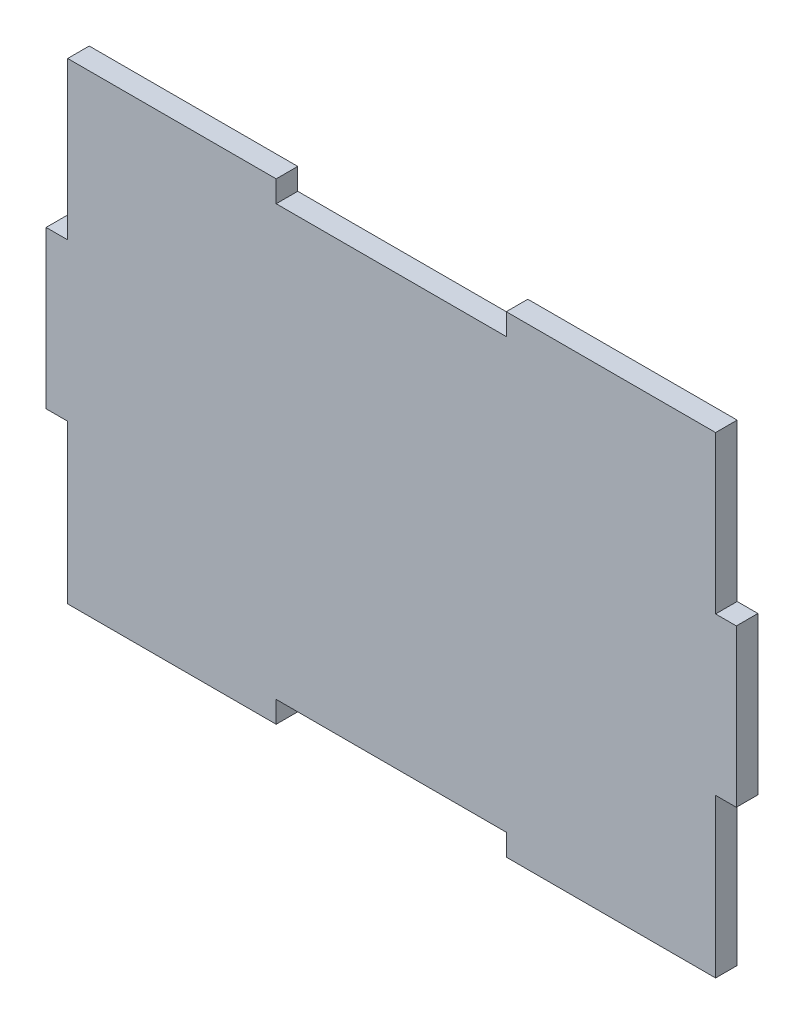
ISO-10303-21;
HEADER;
FILE_DESCRIPTION(('STEP AP214'),'2;1');
FILE_NAME('part.step','',(''),(''),'','','');
FILE_SCHEMA(('AUTOMOTIVE_DESIGN { 1 0 10303 214 1 1 1 1 }'));
ENDSEC;
DATA;
#1=APPLICATION_CONTEXT('core data for automotive mechanical design processes');
#2=APPLICATION_PROTOCOL_DEFINITION('international standard','automotive_design',2000,#1);
#3=PRODUCT_CONTEXT('',#1,'mechanical');
#4=PRODUCT('Part','Part','',(#3));
#5=PRODUCT_RELATED_PRODUCT_CATEGORY('part','',(#4));
#6=PRODUCT_DEFINITION_FORMATION('','',#4);
#7=PRODUCT_DEFINITION_CONTEXT('part definition',#1,'design');
#8=PRODUCT_DEFINITION('design','',#6,#7);
#9=PRODUCT_DEFINITION_SHAPE('','',#8);
#10=(LENGTH_UNIT() NAMED_UNIT(*) SI_UNIT(.MILLI.,.METRE.));
#11=(NAMED_UNIT(*) PLANE_ANGLE_UNIT() SI_UNIT($,.RADIAN.));
#12=(NAMED_UNIT(*) SI_UNIT($,.STERADIAN.) SOLID_ANGLE_UNIT());
#13=UNCERTAINTY_MEASURE_WITH_UNIT(LENGTH_MEASURE(1.E-05),#10,'distance_accuracy_value','');
#14=(GEOMETRIC_REPRESENTATION_CONTEXT(3) GLOBAL_UNCERTAINTY_ASSIGNED_CONTEXT((#13)) GLOBAL_UNIT_ASSIGNED_CONTEXT((#10,
#11,#12)) REPRESENTATION_CONTEXT('',''));
#15=CARTESIAN_POINT('',(0.,0.,0.));
#16=DIRECTION('',(0.,0.,1.));
#17=DIRECTION('',(1.,0.,0.));
#18=AXIS2_PLACEMENT_3D('',#15,#16,#17);
#19=CARTESIAN_POINT('',(40.64,27.813,2.54));
#20=DIRECTION('',(0.,-1.,0.));
#21=DIRECTION('',(1.,0.,0.));
#22=AXIS2_PLACEMENT_3D('',#19,#20,#21);
#23=PLANE('',#22);
#24=DIRECTION('',(0.,0.,1.));
#25=VECTOR('',#24,1.);
#26=CARTESIAN_POINT('',(13.5466666666679,27.813,50.8));
#27=LINE('',#26,#25);
#28=CARTESIAN_POINT('',(13.546666666668,27.813,0.));
#29=VERTEX_POINT('',#28);
#30=CARTESIAN_POINT('',(13.5466666666679,27.813,2.54));
#31=VERTEX_POINT('',#30);
#32=EDGE_CURVE('E182',#29,#31,#27,.T.);
#33=ORIENTED_EDGE('',*,*,#32,.T.);
#34=DIRECTION('',(-1.,0.,0.));
#35=VECTOR('',#34,1.);
#36=CARTESIAN_POINT('',(40.64,27.813,2.54));
#37=LINE('',#36,#35);
#38=CARTESIAN_POINT('',(38.1995707833595,27.813,2.54));
#39=VERTEX_POINT('',#38);
#40=EDGE_CURVE('E43',#39,#31,#37,.T.);
#41=ORIENTED_EDGE('',*,*,#40,.F.);
#42=DIRECTION('',(0.,0.,1.));
#43=VECTOR('',#42,1.);
#44=CARTESIAN_POINT('',(38.1995707833595,27.813,0.));
#45=LINE('',#44,#43);
#46=CARTESIAN_POINT('',(38.1995707833595,27.813,0.));
#47=VERTEX_POINT('',#46);
#48=EDGE_CURVE('E254',#47,#39,#45,.T.);
#49=ORIENTED_EDGE('',*,*,#48,.F.);
#50=DIRECTION('',(-1.,0.,0.));
#51=VECTOR('',#50,1.);
#52=CARTESIAN_POINT('',(40.64,27.813,0.));
#53=LINE('',#52,#51);
#54=EDGE_CURVE('E300',#47,#29,#53,.T.);
#55=ORIENTED_EDGE('',*,*,#54,.T.);
#56=EDGE_LOOP('',(#33,#41,#49,#55));
#57=FACE_BOUND('',#56,.T.);
#58=ADVANCED_FACE('F35',(#57),#23,.F.);
#59=CARTESIAN_POINT('',(40.64,-27.813,2.54));
#60=DIRECTION('',(0.,1.,0.));
#61=DIRECTION('',(-1.,0.,0.));
#62=AXIS2_PLACEMENT_3D('',#59,#60,#61);
#63=PLANE('',#62);
#64=DIRECTION('',(0.,0.,1.));
#65=VECTOR('',#64,1.);
#66=CARTESIAN_POINT('',(-13.5466666666654,-27.813,50.8));
#67=LINE('',#66,#65);
#68=CARTESIAN_POINT('',(-13.5466666666654,-27.813,0.));
#69=VERTEX_POINT('',#68);
#70=CARTESIAN_POINT('',(-13.5466666666654,-27.813,2.54));
#71=VERTEX_POINT('',#70);
#72=EDGE_CURVE('E203',#69,#71,#67,.T.);
#73=ORIENTED_EDGE('',*,*,#72,.T.);
#74=DIRECTION('',(1.,0.,0.));
#75=VECTOR('',#74,1.);
#76=CARTESIAN_POINT('',(40.64,-27.813,2.54));
#77=LINE('',#76,#75);
#78=CARTESIAN_POINT('',(-38.1,-27.813,2.54));
#79=VERTEX_POINT('',#78);
#80=EDGE_CURVE('E301',#79,#71,#77,.T.);
#81=ORIENTED_EDGE('',*,*,#80,.F.);
#82=DIRECTION('',(0.,0.,1.));
#83=VECTOR('',#82,1.);
#84=CARTESIAN_POINT('',(-38.1,-27.813,0.));
#85=LINE('',#84,#83);
#86=CARTESIAN_POINT('',(-38.1,-27.813,0.));
#87=VERTEX_POINT('',#86);
#88=EDGE_CURVE('E271',#87,#79,#85,.T.);
#89=ORIENTED_EDGE('',*,*,#88,.F.);
#90=DIRECTION('',(1.,0.,0.));
#91=VECTOR('',#90,1.);
#92=CARTESIAN_POINT('',(40.64,-27.813,0.));
#93=LINE('',#92,#91);
#94=EDGE_CURVE('E312',#87,#69,#93,.T.);
#95=ORIENTED_EDGE('',*,*,#94,.T.);
#96=EDGE_LOOP('',(#73,#81,#89,#95));
#97=FACE_BOUND('',#96,.T.);
#98=ADVANCED_FACE('F386',(#97),#63,.F.);
#99=CARTESIAN_POINT('',(0.,0.,2.54));
#100=DIRECTION('',(0.,0.,1.));
#101=DIRECTION('',(1.,0.,0.));
#102=AXIS2_PLACEMENT_3D('',#99,#100,#101);
#103=PLANE('',#102);
#104=DIRECTION('',(0.,-1.,0.));
#105=VECTOR('',#104,1.);
#106=CARTESIAN_POINT('',(-13.5466666666654,0.,2.54));
#107=LINE('',#106,#105);
#108=CARTESIAN_POINT('',(-13.5466666666654,27.813,2.54));
#109=VERTEX_POINT('',#108);
#110=CARTESIAN_POINT('',(-13.5466666666654,25.273,2.54));
#111=VERTEX_POINT('',#110);
#112=EDGE_CURVE('E195',#109,#111,#107,.T.);
#113=ORIENTED_EDGE('',*,*,#112,.F.);
#114=CARTESIAN_POINT('',(-38.1,27.813,2.54));
#115=VERTEX_POINT('',#114);
#116=EDGE_CURVE('E306',#109,#115,#37,.T.);
#117=ORIENTED_EDGE('',*,*,#116,.T.);
#118=DIRECTION('',(0.,1.,0.));
#119=VECTOR('',#118,1.);
#120=CARTESIAN_POINT('',(-38.1,0.,2.54));
#121=LINE('',#120,#119);
#122=CARTESIAN_POINT('',(-38.1,9.31339467741539,2.54));
#123=VERTEX_POINT('',#122);
#124=EDGE_CURVE('E281',#123,#115,#121,.T.);
#125=ORIENTED_EDGE('',*,*,#124,.F.);
#126=DIRECTION('',(-1.,0.,0.));
#127=VECTOR('',#126,1.);
#128=CARTESIAN_POINT('',(0.,9.31339467741539,2.54));
#129=LINE('',#128,#127);
#130=CARTESIAN_POINT('',(-40.64,9.31339467741539,2.54));
#131=VERTEX_POINT('',#130);
#132=EDGE_CURVE('E273',#123,#131,#129,.T.);
#133=ORIENTED_EDGE('',*,*,#132,.T.);
#134=DIRECTION('',(0.,-1.,0.));
#135=VECTOR('',#134,1.);
#136=CARTESIAN_POINT('',(-40.64,-27.813,2.54));
#137=LINE('',#136,#135);
#138=CARTESIAN_POINT('',(-40.64,-9.18621064516922,2.54));
#139=VERTEX_POINT('',#138);
#140=EDGE_CURVE('E296',#131,#139,#137,.T.);
#141=ORIENTED_EDGE('',*,*,#140,.T.);
#142=DIRECTION('',(-1.,0.,0.));
#143=VECTOR('',#142,1.);
#144=CARTESIAN_POINT('',(0.,-9.18621064516922,2.54));
#145=LINE('',#144,#143);
#146=CARTESIAN_POINT('',(-38.1,-9.18621064516922,2.54));
#147=VERTEX_POINT('',#146);
#148=EDGE_CURVE('E264',#147,#139,#145,.T.);
#149=ORIENTED_EDGE('',*,*,#148,.F.);
#150=DIRECTION('',(0.,-1.,0.));
#151=VECTOR('',#150,1.);
#152=CARTESIAN_POINT('',(-38.1,0.,2.54));
#153=LINE('',#152,#151);
#154=EDGE_CURVE('E256',#147,#79,#153,.T.);
#155=ORIENTED_EDGE('',*,*,#154,.T.);
#156=ORIENTED_EDGE('',*,*,#80,.T.);
#157=DIRECTION('',(0.,1.,0.));
#158=VECTOR('',#157,1.);
#159=CARTESIAN_POINT('',(-13.5466666666654,0.,2.54));
#160=LINE('',#159,#158);
#161=CARTESIAN_POINT('',(-13.5466666666654,-25.273,2.54));
#162=VERTEX_POINT('',#161);
#163=EDGE_CURVE('E58',#71,#162,#160,.T.);
#164=ORIENTED_EDGE('',*,*,#163,.T.);
#165=DIRECTION('',(1.,0.,0.));
#166=VECTOR('',#165,1.);
#167=CARTESIAN_POINT('',(0.,-25.273,2.54));
#168=LINE('',#167,#166);
#169=CARTESIAN_POINT('',(13.546666666668,-25.273,2.54));
#170=VERTEX_POINT('',#169);
#171=EDGE_CURVE('E223',#162,#170,#168,.T.);
#172=ORIENTED_EDGE('',*,*,#171,.T.);
#173=DIRECTION('',(0.,1.,0.));
#174=VECTOR('',#173,1.);
#175=CARTESIAN_POINT('',(13.546666666668,0.,2.54));
#176=LINE('',#175,#174);
#177=CARTESIAN_POINT('',(13.546666666668,-27.813,2.54));
#178=VERTEX_POINT('',#177);
#179=EDGE_CURVE('E221',#178,#170,#176,.T.);
#180=ORIENTED_EDGE('',*,*,#179,.F.);
#181=CARTESIAN_POINT('',(38.1995707833595,-27.813,2.54));
#182=VERTEX_POINT('',#181);
#183=EDGE_CURVE('E299',#178,#182,#77,.T.);
#184=ORIENTED_EDGE('',*,*,#183,.T.);
#185=DIRECTION('',(0.,-1.,0.));
#186=VECTOR('',#185,1.);
#187=CARTESIAN_POINT('',(38.1995707833595,0.,2.54));
#188=LINE('',#187,#186);
#189=CARTESIAN_POINT('',(38.1995707833595,-9.18621064516922,2.54));
#190=VERTEX_POINT('',#189);
#191=EDGE_CURVE('E230',#190,#182,#188,.T.);
#192=ORIENTED_EDGE('',*,*,#191,.F.);
#193=DIRECTION('',(1.,0.,0.));
#194=VECTOR('',#193,1.);
#195=CARTESIAN_POINT('',(0.,-9.18621064516922,2.54));
#196=LINE('',#195,#194);
#197=CARTESIAN_POINT('',(40.64,-9.18621064516922,2.54));
#198=VERTEX_POINT('',#197);
#199=EDGE_CURVE('E226',#190,#198,#196,.T.);
#200=ORIENTED_EDGE('',*,*,#199,.T.);
#201=DIRECTION('',(0.,1.,0.));
#202=VECTOR('',#201,1.);
#203=CARTESIAN_POINT('',(40.64,-27.813,2.54));
#204=LINE('',#203,#202);
#205=CARTESIAN_POINT('',(40.64,9.31339467741539,2.54));
#206=VERTEX_POINT('',#205);
#207=EDGE_CURVE('E304',#198,#206,#204,.T.);
#208=ORIENTED_EDGE('',*,*,#207,.T.);
#209=DIRECTION('',(1.,0.,0.));
#210=VECTOR('',#209,1.);
#211=CARTESIAN_POINT('',(0.,9.31339467741539,2.54));
#212=LINE('',#211,#210);
#213=CARTESIAN_POINT('',(38.1995707833595,9.31339467741539,2.54));
#214=VERTEX_POINT('',#213);
#215=EDGE_CURVE('E246',#214,#206,#212,.T.);
#216=ORIENTED_EDGE('',*,*,#215,.F.);
#217=DIRECTION('',(0.,1.,0.));
#218=VECTOR('',#217,1.);
#219=CARTESIAN_POINT('',(38.1995707833595,0.,2.54));
#220=LINE('',#219,#218);
#221=EDGE_CURVE('E241',#214,#39,#220,.T.);
#222=ORIENTED_EDGE('',*,*,#221,.T.);
#223=ORIENTED_EDGE('',*,*,#40,.T.);
#224=DIRECTION('',(0.,-1.,0.));
#225=VECTOR('',#224,1.);
#226=CARTESIAN_POINT('',(13.546666666668,0.,2.54));
#227=LINE('',#226,#225);
#228=CARTESIAN_POINT('',(13.546666666668,25.273,2.54));
#229=VERTEX_POINT('',#228);
#230=EDGE_CURVE('E50',#31,#229,#227,.T.);
#231=ORIENTED_EDGE('',*,*,#230,.T.);
#232=DIRECTION('',(-1.,0.,0.));
#233=VECTOR('',#232,1.);
#234=CARTESIAN_POINT('',(0.,25.273,2.54));
#235=LINE('',#234,#233);
#236=EDGE_CURVE('E180',#229,#111,#235,.T.);
#237=ORIENTED_EDGE('',*,*,#236,.T.);
#238=EDGE_LOOP('',(#113,#117,#125,#133,#141,#149,#155,#156,#164,#172,#180,#184,#192,#200,#208,
#216,#222,#223,#231,#237));
#239=FACE_BOUND('',#238,.T.);
#240=ADVANCED_FACE('F339',(#239),#103,.T.);
#241=CARTESIAN_POINT('',(0.,0.,0.));
#242=DIRECTION('',(0.,0.,1.));
#243=DIRECTION('',(1.,0.,0.));
#244=AXIS2_PLACEMENT_3D('',#241,#242,#243);
#245=PLANE('',#244);
#246=CARTESIAN_POINT('',(-13.5466666666654,27.813,0.));
#247=VERTEX_POINT('',#246);
#248=CARTESIAN_POINT('',(-38.1,27.813,0.));
#249=VERTEX_POINT('',#248);
#250=EDGE_CURVE('E316',#247,#249,#53,.T.);
#251=ORIENTED_EDGE('',*,*,#250,.F.);
#252=DIRECTION('',(0.,1.,0.));
#253=VECTOR('',#252,1.);
#254=CARTESIAN_POINT('',(-13.5466666666654,25.273,0.));
#255=LINE('',#254,#253);
#256=CARTESIAN_POINT('',(-13.5466666666654,25.273,0.));
#257=VERTEX_POINT('',#256);
#258=EDGE_CURVE('E193',#257,#247,#255,.T.);
#259=ORIENTED_EDGE('',*,*,#258,.F.);
#260=DIRECTION('',(1.,0.,0.));
#261=VECTOR('',#260,1.);
#262=CARTESIAN_POINT('',(40.6400000000013,25.273,0.));
#263=LINE('',#262,#261);
#264=CARTESIAN_POINT('',(13.546666666668,25.273,0.));
#265=VERTEX_POINT('',#264);
#266=EDGE_CURVE('E177',#257,#265,#263,.T.);
#267=ORIENTED_EDGE('',*,*,#266,.T.);
#268=DIRECTION('',(0.,1.,0.));
#269=VECTOR('',#268,1.);
#270=CARTESIAN_POINT('',(13.546666666668,25.273,0.));
#271=LINE('',#270,#269);
#272=EDGE_CURVE('E181',#265,#29,#271,.T.);
#273=ORIENTED_EDGE('',*,*,#272,.T.);
#274=ORIENTED_EDGE('',*,*,#54,.F.);
#275=DIRECTION('',(0.,1.,0.));
#276=VECTOR('',#275,1.);
#277=CARTESIAN_POINT('',(38.1995707833595,0.,0.));
#278=LINE('',#277,#276);
#279=CARTESIAN_POINT('',(38.1995707833595,9.31339467741539,0.));
#280=VERTEX_POINT('',#279);
#281=EDGE_CURVE('E243',#280,#47,#278,.T.);
#282=ORIENTED_EDGE('',*,*,#281,.F.);
#283=DIRECTION('',(1.,0.,0.));
#284=VECTOR('',#283,1.);
#285=CARTESIAN_POINT('',(0.,9.31339467741539,0.));
#286=LINE('',#285,#284);
#287=CARTESIAN_POINT('',(40.64,9.31339467741539,0.));
#288=VERTEX_POINT('',#287);
#289=EDGE_CURVE('E245',#280,#288,#286,.T.);
#290=ORIENTED_EDGE('',*,*,#289,.T.);
#291=DIRECTION('',(0.,1.,0.));
#292=VECTOR('',#291,1.);
#293=CARTESIAN_POINT('',(40.64,-27.813,0.));
#294=LINE('',#293,#292);
#295=CARTESIAN_POINT('',(40.64,-9.18621064516923,0.));
#296=VERTEX_POINT('',#295);
#297=EDGE_CURVE('E315',#296,#288,#294,.T.);
#298=ORIENTED_EDGE('',*,*,#297,.F.);
#299=DIRECTION('',(1.,0.,0.));
#300=VECTOR('',#299,1.);
#301=CARTESIAN_POINT('',(0.,-9.18621064516922,0.));
#302=LINE('',#301,#300);
#303=CARTESIAN_POINT('',(38.1995707833595,-9.18621064516922,0.));
#304=VERTEX_POINT('',#303);
#305=EDGE_CURVE('E227',#304,#296,#302,.T.);
#306=ORIENTED_EDGE('',*,*,#305,.F.);
#307=DIRECTION('',(0.,-1.,0.));
#308=VECTOR('',#307,1.);
#309=CARTESIAN_POINT('',(38.1995707833595,0.,0.));
#310=LINE('',#309,#308);
#311=CARTESIAN_POINT('',(38.1995707833595,-27.813,0.));
#312=VERTEX_POINT('',#311);
#313=EDGE_CURVE('E229',#304,#312,#310,.T.);
#314=ORIENTED_EDGE('',*,*,#313,.T.);
#315=CARTESIAN_POINT('',(13.546666666668,-27.813,0.));
#316=VERTEX_POINT('',#315);
#317=EDGE_CURVE('E311',#316,#312,#93,.T.);
#318=ORIENTED_EDGE('',*,*,#317,.F.);
#319=DIRECTION('',(0.,-1.,0.));
#320=VECTOR('',#319,1.);
#321=CARTESIAN_POINT('',(13.546666666668,-25.273,0.));
#322=LINE('',#321,#320);
#323=CARTESIAN_POINT('',(13.546666666668,-25.273,0.));
#324=VERTEX_POINT('',#323);
#325=EDGE_CURVE('E214',#324,#316,#322,.T.);
#326=ORIENTED_EDGE('',*,*,#325,.F.);
#327=DIRECTION('',(-1.,0.,0.));
#328=VECTOR('',#327,1.);
#329=CARTESIAN_POINT('',(40.6400000000013,-25.273,0.));
#330=LINE('',#329,#328);
#331=CARTESIAN_POINT('',(-13.5466666666654,-25.273,0.));
#332=VERTEX_POINT('',#331);
#333=EDGE_CURVE('E217',#324,#332,#330,.T.);
#334=ORIENTED_EDGE('',*,*,#333,.T.);
#335=DIRECTION('',(0.,-1.,0.));
#336=VECTOR('',#335,1.);
#337=CARTESIAN_POINT('',(-13.5466666666654,-25.273,0.));
#338=LINE('',#337,#336);
#339=EDGE_CURVE('E206',#332,#69,#338,.T.);
#340=ORIENTED_EDGE('',*,*,#339,.T.);
#341=ORIENTED_EDGE('',*,*,#94,.F.);
#342=DIRECTION('',(0.,-1.,0.));
#343=VECTOR('',#342,1.);
#344=CARTESIAN_POINT('',(-38.1,0.,0.));
#345=LINE('',#344,#343);
#346=CARTESIAN_POINT('',(-38.1,-9.18621064516922,0.));
#347=VERTEX_POINT('',#346);
#348=EDGE_CURVE('E261',#347,#87,#345,.T.);
#349=ORIENTED_EDGE('',*,*,#348,.F.);
#350=DIRECTION('',(-1.,0.,0.));
#351=VECTOR('',#350,1.);
#352=CARTESIAN_POINT('',(0.,-9.18621064516922,0.));
#353=LINE('',#352,#351);
#354=CARTESIAN_POINT('',(-40.64,-9.18621064516922,0.));
#355=VERTEX_POINT('',#354);
#356=EDGE_CURVE('E263',#347,#355,#353,.T.);
#357=ORIENTED_EDGE('',*,*,#356,.T.);
#358=DIRECTION('',(0.,-1.,0.));
#359=VECTOR('',#358,1.);
#360=CARTESIAN_POINT('',(-40.64,-27.813,0.));
#361=LINE('',#360,#359);
#362=CARTESIAN_POINT('',(-40.64,9.31339467741539,0.));
#363=VERTEX_POINT('',#362);
#364=EDGE_CURVE('E291',#363,#355,#361,.T.);
#365=ORIENTED_EDGE('',*,*,#364,.F.);
#366=DIRECTION('',(-1.,0.,0.));
#367=VECTOR('',#366,1.);
#368=CARTESIAN_POINT('',(0.,9.31339467741539,0.));
#369=LINE('',#368,#367);
#370=CARTESIAN_POINT('',(-38.1,9.31339467741539,0.));
#371=VERTEX_POINT('',#370);
#372=EDGE_CURVE('E278',#371,#363,#369,.T.);
#373=ORIENTED_EDGE('',*,*,#372,.F.);
#374=DIRECTION('',(0.,1.,0.));
#375=VECTOR('',#374,1.);
#376=CARTESIAN_POINT('',(-38.1,0.,0.));
#377=LINE('',#376,#375);
#378=EDGE_CURVE('E280',#371,#249,#377,.T.);
#379=ORIENTED_EDGE('',*,*,#378,.T.);
#380=EDGE_LOOP('',(#251,#259,#267,#273,#274,#282,#290,#298,#306,#314,#318,#326,#334,#340,#341,
#349,#357,#365,#373,#379));
#381=FACE_BOUND('',#380,.T.);
#382=ADVANCED_FACE('F192',(#381),#245,.F.);
#383=CARTESIAN_POINT('',(40.64,-27.813,2.54));
#384=DIRECTION('',(-1.,0.,0.));
#385=DIRECTION('',(0.,0.,1.));
#386=AXIS2_PLACEMENT_3D('',#383,#384,#385);
#387=PLANE('',#386);
#388=DIRECTION('',(0.,0.,1.));
#389=VECTOR('',#388,1.);
#390=CARTESIAN_POINT('',(40.64,-9.18621064516922,2.54));
#391=LINE('',#390,#389);
#392=EDGE_CURVE('E11',#296,#198,#391,.T.);
#393=ORIENTED_EDGE('',*,*,#392,.F.);
#394=ORIENTED_EDGE('',*,*,#297,.T.);
#395=DIRECTION('',(0.,0.,1.));
#396=VECTOR('',#395,1.);
#397=CARTESIAN_POINT('',(40.64,9.31339467741539,0.));
#398=LINE('',#397,#396);
#399=EDGE_CURVE('E257',#288,#206,#398,.T.);
#400=ORIENTED_EDGE('',*,*,#399,.T.);
#401=ORIENTED_EDGE('',*,*,#207,.F.);
#402=EDGE_LOOP('',(#393,#394,#400,#401));
#403=FACE_BOUND('',#402,.T.);
#404=ADVANCED_FACE('F359',(#403),#387,.F.);
#405=ORIENTED_EDGE('',*,*,#116,.F.);
#406=DIRECTION('',(0.,0.,1.));
#407=VECTOR('',#406,1.);
#408=CARTESIAN_POINT('',(-13.5466666666654,27.813,50.8));
#409=LINE('',#408,#407);
#410=EDGE_CURVE('E189',#247,#109,#409,.T.);
#411=ORIENTED_EDGE('',*,*,#410,.F.);
#412=ORIENTED_EDGE('',*,*,#250,.T.);
#413=DIRECTION('',(0.,0.,1.));
#414=VECTOR('',#413,1.);
#415=CARTESIAN_POINT('',(-38.1,27.813,0.));
#416=LINE('',#415,#414);
#417=EDGE_CURVE('E292',#249,#115,#416,.T.);
#418=ORIENTED_EDGE('',*,*,#417,.T.);
#419=EDGE_LOOP('',(#405,#411,#412,#418));
#420=FACE_BOUND('',#419,.T.);
#421=ADVANCED_FACE('F323',(#420),#23,.F.);
#422=ORIENTED_EDGE('',*,*,#183,.F.);
#423=DIRECTION('',(0.,0.,1.));
#424=VECTOR('',#423,1.);
#425=CARTESIAN_POINT('',(13.5466666666679,-27.813,50.8));
#426=LINE('',#425,#424);
#427=EDGE_CURVE('E210',#316,#178,#426,.T.);
#428=ORIENTED_EDGE('',*,*,#427,.F.);
#429=ORIENTED_EDGE('',*,*,#317,.T.);
#430=DIRECTION('',(0.,0.,1.));
#431=VECTOR('',#430,1.);
#432=CARTESIAN_POINT('',(38.1995707833595,-27.813,0.));
#433=LINE('',#432,#431);
#434=EDGE_CURVE('E238',#312,#182,#433,.T.);
#435=ORIENTED_EDGE('',*,*,#434,.T.);
#436=EDGE_LOOP('',(#422,#428,#429,#435));
#437=FACE_BOUND('',#436,.T.);
#438=ADVANCED_FACE('F371',(#437),#63,.F.);
#439=CARTESIAN_POINT('',(-40.64,-27.813,2.54));
#440=DIRECTION('',(1.,0.,0.));
#441=DIRECTION('',(0.,0.,-1.));
#442=AXIS2_PLACEMENT_3D('',#439,#440,#441);
#443=PLANE('',#442);
#444=ORIENTED_EDGE('',*,*,#364,.T.);
#445=DIRECTION('',(0.,0.,1.));
#446=VECTOR('',#445,1.);
#447=CARTESIAN_POINT('',(-40.64,-9.18621064516922,0.));
#448=LINE('',#447,#446);
#449=EDGE_CURVE('E274',#355,#139,#448,.T.);
#450=ORIENTED_EDGE('',*,*,#449,.T.);
#451=ORIENTED_EDGE('',*,*,#140,.F.);
#452=DIRECTION('',(0.,0.,1.));
#453=VECTOR('',#452,1.);
#454=CARTESIAN_POINT('',(-40.64,9.31339467741539,0.));
#455=LINE('',#454,#453);
#456=EDGE_CURVE('E289',#363,#131,#455,.T.);
#457=ORIENTED_EDGE('',*,*,#456,.F.);
#458=EDGE_LOOP('',(#444,#450,#451,#457));
#459=FACE_BOUND('',#458,.T.);
#460=ADVANCED_FACE('F37',(#459),#443,.F.);
#461=CARTESIAN_POINT('',(0.,9.31339467741539,0.));
#462=DIRECTION('',(0.,1.,0.));
#463=DIRECTION('',(0.,0.,1.));
#464=AXIS2_PLACEMENT_3D('',#461,#462,#463);
#465=PLANE('',#464);
#466=ORIENTED_EDGE('',*,*,#132,.F.);
#467=DIRECTION('',(0.,0.,1.));
#468=VECTOR('',#467,1.);
#469=CARTESIAN_POINT('',(-38.1,9.31339467741539,0.));
#470=LINE('',#469,#468);
#471=EDGE_CURVE('E284',#371,#123,#470,.T.);
#472=ORIENTED_EDGE('',*,*,#471,.F.);
#473=ORIENTED_EDGE('',*,*,#372,.T.);
#474=ORIENTED_EDGE('',*,*,#456,.T.);
#475=EDGE_LOOP('',(#466,#472,#473,#474));
#476=FACE_BOUND('',#475,.T.);
#477=ADVANCED_FACE('F333',(#476),#465,.T.);
#478=CARTESIAN_POINT('',(-38.1,0.,0.));
#479=DIRECTION('',(1.,0.,0.));
#480=DIRECTION('',(0.,1.,0.));
#481=AXIS2_PLACEMENT_3D('',#478,#479,#480);
#482=PLANE('',#481);
#483=ORIENTED_EDGE('',*,*,#124,.T.);
#484=ORIENTED_EDGE('',*,*,#417,.F.);
#485=ORIENTED_EDGE('',*,*,#378,.F.);
#486=ORIENTED_EDGE('',*,*,#471,.T.);
#487=EDGE_LOOP('',(#483,#484,#485,#486));
#488=FACE_BOUND('',#487,.T.);
#489=ADVANCED_FACE('F326',(#488),#482,.F.);
#490=CARTESIAN_POINT('',(-38.1,0.,0.));
#491=DIRECTION('',(-1.,0.,0.));
#492=DIRECTION('',(0.,-1.,0.));
#493=AXIS2_PLACEMENT_3D('',#490,#491,#492);
#494=PLANE('',#493);
#495=ORIENTED_EDGE('',*,*,#154,.F.);
#496=DIRECTION('',(0.,0.,1.));
#497=VECTOR('',#496,1.);
#498=CARTESIAN_POINT('',(-38.1,-9.18621064516922,0.));
#499=LINE('',#498,#497);
#500=EDGE_CURVE('E267',#347,#147,#499,.T.);
#501=ORIENTED_EDGE('',*,*,#500,.F.);
#502=ORIENTED_EDGE('',*,*,#348,.T.);
#503=ORIENTED_EDGE('',*,*,#88,.T.);
#504=EDGE_LOOP('',(#495,#501,#502,#503));
#505=FACE_BOUND('',#504,.T.);
#506=ADVANCED_FACE('F390',(#505),#494,.T.);
#507=CARTESIAN_POINT('',(0.,-9.18621064516922,0.));
#508=DIRECTION('',(0.,1.,0.));
#509=DIRECTION('',(0.,0.,1.));
#510=AXIS2_PLACEMENT_3D('',#507,#508,#509);
#511=PLANE('',#510);
#512=ORIENTED_EDGE('',*,*,#148,.T.);
#513=ORIENTED_EDGE('',*,*,#449,.F.);
#514=ORIENTED_EDGE('',*,*,#356,.F.);
#515=ORIENTED_EDGE('',*,*,#500,.T.);
#516=EDGE_LOOP('',(#512,#513,#514,#515));
#517=FACE_BOUND('',#516,.T.);
#518=ADVANCED_FACE('F393',(#517),#511,.F.);
#519=CARTESIAN_POINT('',(38.1995707833595,0.,0.));
#520=DIRECTION('',(1.,0.,0.));
#521=DIRECTION('',(0.,1.,0.));
#522=AXIS2_PLACEMENT_3D('',#519,#520,#521);
#523=PLANE('',#522);
#524=ORIENTED_EDGE('',*,*,#221,.F.);
#525=DIRECTION('',(0.,0.,1.));
#526=VECTOR('',#525,1.);
#527=CARTESIAN_POINT('',(38.1995707833595,9.31339467741539,0.));
#528=LINE('',#527,#526);
#529=EDGE_CURVE('E249',#280,#214,#528,.T.);
#530=ORIENTED_EDGE('',*,*,#529,.F.);
#531=ORIENTED_EDGE('',*,*,#281,.T.);
#532=ORIENTED_EDGE('',*,*,#48,.T.);
#533=EDGE_LOOP('',(#524,#530,#531,#532));
#534=FACE_BOUND('',#533,.T.);
#535=ADVANCED_FACE('F348',(#534),#523,.T.);
#536=CARTESIAN_POINT('',(0.,9.31339467741539,0.));
#537=DIRECTION('',(0.,-1.,0.));
#538=DIRECTION('',(0.,0.,-1.));
#539=AXIS2_PLACEMENT_3D('',#536,#537,#538);
#540=PLANE('',#539);
#541=ORIENTED_EDGE('',*,*,#215,.T.);
#542=ORIENTED_EDGE('',*,*,#399,.F.);
#543=ORIENTED_EDGE('',*,*,#289,.F.);
#544=ORIENTED_EDGE('',*,*,#529,.T.);
#545=EDGE_LOOP('',(#541,#542,#543,#544));
#546=FACE_BOUND('',#545,.T.);
#547=ADVANCED_FACE('F355',(#546),#540,.F.);
#548=CARTESIAN_POINT('',(0.,-9.18621064516922,0.));
#549=DIRECTION('',(0.,-1.,0.));
#550=DIRECTION('',(0.,0.,-1.));
#551=AXIS2_PLACEMENT_3D('',#548,#549,#550);
#552=PLANE('',#551);
#553=ORIENTED_EDGE('',*,*,#392,.T.);
#554=ORIENTED_EDGE('',*,*,#199,.F.);
#555=DIRECTION('',(0.,0.,1.));
#556=VECTOR('',#555,1.);
#557=CARTESIAN_POINT('',(38.1995707833595,-9.18621064516922,0.));
#558=LINE('',#557,#556);
#559=EDGE_CURVE('E233',#304,#190,#558,.T.);
#560=ORIENTED_EDGE('',*,*,#559,.F.);
#561=ORIENTED_EDGE('',*,*,#305,.T.);
#562=EDGE_LOOP('',(#553,#554,#560,#561));
#563=FACE_BOUND('',#562,.T.);
#564=ADVANCED_FACE('F362',(#563),#552,.T.);
#565=CARTESIAN_POINT('',(38.1995707833595,0.,0.));
#566=DIRECTION('',(-1.,0.,0.));
#567=DIRECTION('',(0.,-1.,0.));
#568=AXIS2_PLACEMENT_3D('',#565,#566,#567);
#569=PLANE('',#568);
#570=ORIENTED_EDGE('',*,*,#191,.T.);
#571=ORIENTED_EDGE('',*,*,#434,.F.);
#572=ORIENTED_EDGE('',*,*,#313,.F.);
#573=ORIENTED_EDGE('',*,*,#559,.T.);
#574=EDGE_LOOP('',(#570,#571,#572,#573));
#575=FACE_BOUND('',#574,.T.);
#576=ADVANCED_FACE('F368',(#575),#569,.F.);
#577=CARTESIAN_POINT('',(1.27653963788443E-12,-25.273,50.8));
#578=DIRECTION('',(0.,-1.,0.));
#579=DIRECTION('',(-1.,0.,0.));
#580=AXIS2_PLACEMENT_3D('',#577,#578,#579);
#581=PLANE('',#580);
#582=DIRECTION('',(0.,0.,1.));
#583=VECTOR('',#582,1.);
#584=CARTESIAN_POINT('',(-13.5466666666654,-25.273,50.8));
#585=LINE('',#584,#583);
#586=EDGE_CURVE('E204',#332,#162,#585,.T.);
#587=ORIENTED_EDGE('',*,*,#586,.F.);
#588=ORIENTED_EDGE('',*,*,#333,.F.);
#589=DIRECTION('',(0.,0.,1.));
#590=VECTOR('',#589,1.);
#591=CARTESIAN_POINT('',(13.5466666666679,-25.273,50.8));
#592=LINE('',#591,#590);
#593=EDGE_CURVE('E211',#324,#170,#592,.T.);
#594=ORIENTED_EDGE('',*,*,#593,.T.);
#595=ORIENTED_EDGE('',*,*,#171,.F.);
#596=EDGE_LOOP('',(#587,#588,#594,#595));
#597=FACE_BOUND('',#596,.T.);
#598=ADVANCED_FACE('F379',(#597),#581,.T.);
#599=CARTESIAN_POINT('',(13.5466666666679,-25.273,50.8));
#600=DIRECTION('',(1.,0.,0.));
#601=DIRECTION('',(0.,0.,-1.));
#602=AXIS2_PLACEMENT_3D('',#599,#600,#601);
#603=PLANE('',#602);
#604=ORIENTED_EDGE('',*,*,#179,.T.);
#605=ORIENTED_EDGE('',*,*,#593,.F.);
#606=ORIENTED_EDGE('',*,*,#325,.T.);
#607=ORIENTED_EDGE('',*,*,#427,.T.);
#608=EDGE_LOOP('',(#604,#605,#606,#607));
#609=FACE_BOUND('',#608,.T.);
#610=ADVANCED_FACE('F377',(#609),#603,.F.);
#611=CARTESIAN_POINT('',(-13.5466666666654,-25.273,50.8));
#612=DIRECTION('',(1.,0.,0.));
#613=DIRECTION('',(0.,0.,-1.));
#614=AXIS2_PLACEMENT_3D('',#611,#612,#613);
#615=PLANE('',#614);
#616=ORIENTED_EDGE('',*,*,#72,.F.);
#617=ORIENTED_EDGE('',*,*,#339,.F.);
#618=ORIENTED_EDGE('',*,*,#586,.T.);
#619=ORIENTED_EDGE('',*,*,#163,.F.);
#620=EDGE_LOOP('',(#616,#617,#618,#619));
#621=FACE_BOUND('',#620,.T.);
#622=ADVANCED_FACE('F381',(#621),#615,.T.);
#623=CARTESIAN_POINT('',(1.27697331875343E-12,25.273,50.8));
#624=DIRECTION('',(0.,1.,0.));
#625=DIRECTION('',(-1.,0.,0.));
#626=AXIS2_PLACEMENT_3D('',#623,#624,#625);
#627=PLANE('',#626);
#628=DIRECTION('',(0.,0.,1.));
#629=VECTOR('',#628,1.);
#630=CARTESIAN_POINT('',(13.5466666666679,25.273,50.8));
#631=LINE('',#630,#629);
#632=EDGE_CURVE('E172',#265,#229,#631,.T.);
#633=ORIENTED_EDGE('',*,*,#632,.F.);
#634=ORIENTED_EDGE('',*,*,#266,.F.);
#635=DIRECTION('',(0.,0.,1.));
#636=VECTOR('',#635,1.);
#637=CARTESIAN_POINT('',(-13.5466666666654,25.273,50.8));
#638=LINE('',#637,#636);
#639=EDGE_CURVE('E197',#257,#111,#638,.T.);
#640=ORIENTED_EDGE('',*,*,#639,.T.);
#641=ORIENTED_EDGE('',*,*,#236,.F.);
#642=EDGE_LOOP('',(#633,#634,#640,#641));
#643=FACE_BOUND('',#642,.T.);
#644=ADVANCED_FACE('F174',(#643),#627,.T.);
#645=CARTESIAN_POINT('',(-13.5466666666654,25.273,50.8));
#646=DIRECTION('',(-1.,0.,0.));
#647=DIRECTION('',(0.,0.,-1.));
#648=AXIS2_PLACEMENT_3D('',#645,#646,#647);
#649=PLANE('',#648);
#650=ORIENTED_EDGE('',*,*,#112,.T.);
#651=ORIENTED_EDGE('',*,*,#639,.F.);
#652=ORIENTED_EDGE('',*,*,#258,.T.);
#653=ORIENTED_EDGE('',*,*,#410,.T.);
#654=EDGE_LOOP('',(#650,#651,#652,#653));
#655=FACE_BOUND('',#654,.T.);
#656=ADVANCED_FACE('F341',(#655),#649,.F.);
#657=CARTESIAN_POINT('',(13.5466666666679,25.273,50.8));
#658=DIRECTION('',(-1.,0.,0.));
#659=DIRECTION('',(0.,0.,-1.));
#660=AXIS2_PLACEMENT_3D('',#657,#658,#659);
#661=PLANE('',#660);
#662=ORIENTED_EDGE('',*,*,#32,.F.);
#663=ORIENTED_EDGE('',*,*,#272,.F.);
#664=ORIENTED_EDGE('',*,*,#632,.T.);
#665=ORIENTED_EDGE('',*,*,#230,.F.);
#666=EDGE_LOOP('',(#662,#663,#664,#665));
#667=FACE_BOUND('',#666,.T.);
#668=ADVANCED_FACE('F185',(#667),#661,.T.);
#669=CLOSED_SHELL('',(#58,#98,#240,#382,#404,#421,#438,#460,#477,#489,#506,#518,#535,#547,#564,
#576,#598,#610,#622,#644,#656,#668));
#670=MANIFOLD_SOLID_BREP('B2',#669);
#671=ADVANCED_BREP_SHAPE_REPRESENTATION('',(#18,#670),#14);
#672=SHAPE_DEFINITION_REPRESENTATION(#9,#671);
ENDSEC;
END-ISO-10303-21;
